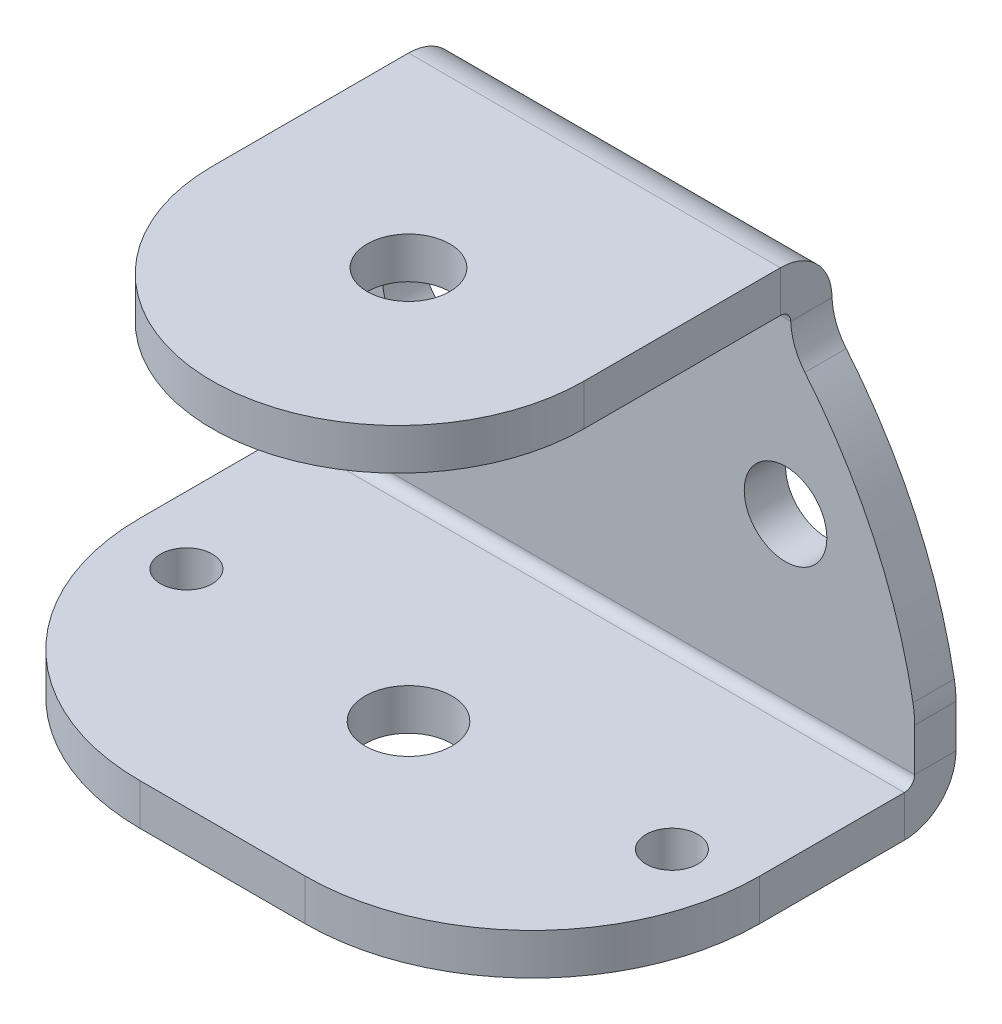
ISO-10303-21;
HEADER;
FILE_DESCRIPTION(('STEP AP214'),'2;1');
FILE_NAME('part.step','',(''),(''),'','','');
FILE_SCHEMA(('AUTOMOTIVE_DESIGN { 1 0 10303 214 1 1 1 1 }'));
ENDSEC;
DATA;
#1=APPLICATION_CONTEXT('core data for automotive mechanical design processes');
#2=APPLICATION_PROTOCOL_DEFINITION('international standard','automotive_design',2000,#1);
#3=PRODUCT_CONTEXT('',#1,'mechanical');
#4=PRODUCT('Part','Part','',(#3));
#5=PRODUCT_RELATED_PRODUCT_CATEGORY('part','',(#4));
#6=PRODUCT_DEFINITION_FORMATION('','',#4);
#7=PRODUCT_DEFINITION_CONTEXT('part definition',#1,'design');
#8=PRODUCT_DEFINITION('design','',#6,#7);
#9=PRODUCT_DEFINITION_SHAPE('','',#8);
#10=(LENGTH_UNIT() NAMED_UNIT(*) SI_UNIT(.MILLI.,.METRE.));
#11=(NAMED_UNIT(*) PLANE_ANGLE_UNIT() SI_UNIT($,.RADIAN.));
#12=(NAMED_UNIT(*) SI_UNIT($,.STERADIAN.) SOLID_ANGLE_UNIT());
#13=UNCERTAINTY_MEASURE_WITH_UNIT(LENGTH_MEASURE(1.E-05),#10,'distance_accuracy_value','');
#14=(GEOMETRIC_REPRESENTATION_CONTEXT(3) GLOBAL_UNCERTAINTY_ASSIGNED_CONTEXT((#13)) GLOBAL_UNIT_ASSIGNED_CONTEXT((#10,
#11,#12)) REPRESENTATION_CONTEXT('',''));
#15=CARTESIAN_POINT('',(0.,0.,0.));
#16=DIRECTION('',(0.,0.,1.));
#17=DIRECTION('',(1.,0.,0.));
#18=AXIS2_PLACEMENT_3D('',#15,#16,#17);
#19=CARTESIAN_POINT('',(15.,19.,9.99999999999999));
#20=DIRECTION('',(0.,1.,0.));
#21=DIRECTION('',(0.,0.,1.));
#22=AXIS2_PLACEMENT_3D('',#19,#20,#21);
#23=PLANE('',#22);
#24=DIRECTION('',(0.,0.,1.));
#25=VECTOR('',#24,1.);
#26=CARTESIAN_POINT('',(24.,19.,9.99999999999999));
#27=LINE('',#26,#25);
#28=CARTESIAN_POINT('',(24.,19.,9.99999999999999));
#29=VERTEX_POINT('',#28);
#30=CARTESIAN_POINT('',(24.,19.,0.49999999999999));
#31=VERTEX_POINT('',#30);
#32=EDGE_CURVE('E238',#29,#31,#27,.F.);
#33=ORIENTED_EDGE('',*,*,#32,.T.);
#34=DIRECTION('',(-1.,0.,0.));
#35=VECTOR('',#34,1.);
#36=CARTESIAN_POINT('',(15.,19.,0.49999999999999));
#37=LINE('',#36,#35);
#38=CARTESIAN_POINT('',(6.,19.,0.49999999999999));
#39=VERTEX_POINT('',#38);
#40=EDGE_CURVE('E213',#31,#39,#37,.T.);
#41=ORIENTED_EDGE('',*,*,#40,.T.);
#42=DIRECTION('',(0.,0.,-1.));
#43=VECTOR('',#42,1.);
#44=CARTESIAN_POINT('',(6.,19.,9.99999999999999));
#45=LINE('',#44,#43);
#46=CARTESIAN_POINT('',(6.,19.,9.99999999999999));
#47=VERTEX_POINT('',#46);
#48=EDGE_CURVE('E235',#39,#47,#45,.F.);
#49=ORIENTED_EDGE('',*,*,#48,.T.);
#50=CARTESIAN_POINT('',(15.,19.,9.99999999999999));
#51=DIRECTION('',(0.,1.,0.));
#52=DIRECTION('',(0.,0.,1.));
#53=AXIS2_PLACEMENT_3D('',#50,#51,#52);
#54=CIRCLE('',#53,9.);
#55=EDGE_CURVE('E245',#47,#29,#54,.T.);
#56=ORIENTED_EDGE('',*,*,#55,.T.);
#57=EDGE_LOOP('',(#33,#41,#49,#56));
#58=FACE_BOUND('',#57,.T.);
#59=CARTESIAN_POINT('',(15.,19.,9.50000000000006));
#60=DIRECTION('',(0.,1.,0.));
#61=DIRECTION('',(0.,0.,1.));
#62=AXIS2_PLACEMENT_3D('',#59,#60,#61);
#63=CIRCLE('',#62,2.);
#64=CARTESIAN_POINT('',(15.,19.,11.5000000000001));
#65=VERTEX_POINT('',#64);
#66=EDGE_CURVE('E875',#65,#65,#63,.T.);
#67=ORIENTED_EDGE('',*,*,#66,.F.);
#68=EDGE_LOOP('',(#67));
#69=FACE_BOUND('',#68,.T.);
#70=ADVANCED_FACE('F69',(#58,#69),#23,.T.);
#71=CARTESIAN_POINT('',(15.,17.,10.));
#72=DIRECTION('',(0.,1.,0.));
#73=DIRECTION('',(0.,0.,1.));
#74=AXIS2_PLACEMENT_3D('',#71,#72,#73);
#75=PLANE('',#74);
#76=DIRECTION('',(1.,0.,0.));
#77=VECTOR('',#76,1.);
#78=CARTESIAN_POINT('',(24.,17.,0.499999999999997));
#79=LINE('',#78,#77);
#80=CARTESIAN_POINT('',(24.,17.,0.499999999999997));
#81=VERTEX_POINT('',#80);
#82=CARTESIAN_POINT('',(6.,17.,0.499999999999997));
#83=VERTEX_POINT('',#82);
#84=EDGE_CURVE('E230',#81,#83,#79,.F.);
#85=ORIENTED_EDGE('',*,*,#84,.F.);
#86=DIRECTION('',(0.,0.,-1.));
#87=VECTOR('',#86,1.);
#88=CARTESIAN_POINT('',(24.,17.,0.));
#89=LINE('',#88,#87);
#90=CARTESIAN_POINT('',(24.,17.,10.));
#91=VERTEX_POINT('',#90);
#92=EDGE_CURVE('E239',#91,#81,#89,.T.);
#93=ORIENTED_EDGE('',*,*,#92,.F.);
#94=CARTESIAN_POINT('',(15.,17.,10.));
#95=DIRECTION('',(0.,1.,0.));
#96=DIRECTION('',(0.,0.,1.));
#97=AXIS2_PLACEMENT_3D('',#94,#95,#96);
#98=CIRCLE('',#97,9.);
#99=CARTESIAN_POINT('',(6.,17.,10.));
#100=VERTEX_POINT('',#99);
#101=EDGE_CURVE('E249',#100,#91,#98,.T.);
#102=ORIENTED_EDGE('',*,*,#101,.F.);
#103=DIRECTION('',(0.,0.,1.));
#104=VECTOR('',#103,1.);
#105=CARTESIAN_POINT('',(6.,17.,10.));
#106=LINE('',#105,#104);
#107=EDGE_CURVE('E254',#83,#100,#106,.T.);
#108=ORIENTED_EDGE('',*,*,#107,.F.);
#109=EDGE_LOOP('',(#85,#93,#102,#108));
#110=FACE_BOUND('',#109,.T.);
#111=CARTESIAN_POINT('',(15.,17.,9.50000000000007));
#112=DIRECTION('',(0.,1.,0.));
#113=DIRECTION('',(0.,0.,1.));
#114=AXIS2_PLACEMENT_3D('',#111,#112,#113);
#115=CIRCLE('',#114,2.);
#116=CARTESIAN_POINT('',(15.,17.,11.5000000000001));
#117=VERTEX_POINT('',#116);
#118=EDGE_CURVE('E878',#117,#117,#115,.T.);
#119=ORIENTED_EDGE('',*,*,#118,.T.);
#120=EDGE_LOOP('',(#119));
#121=FACE_BOUND('',#120,.T.);
#122=ADVANCED_FACE('F443',(#110,#121),#75,.F.);
#123=CARTESIAN_POINT('',(30.,0.,-2.));
#124=DIRECTION('',(1.,0.,0.));
#125=DIRECTION('',(0.,0.,-1.));
#126=AXIS2_PLACEMENT_3D('',#123,#124,#125);
#127=PLANE('',#126);
#128=DIRECTION('',(0.,1.,0.));
#129=VECTOR('',#128,1.);
#130=CARTESIAN_POINT('',(30.,0.,0.));
#131=LINE('',#130,#129);
#132=CARTESIAN_POINT('',(30.,0.499999999999998,0.));
#133=VERTEX_POINT('',#132);
#134=CARTESIAN_POINT('',(30.,2.57347687138422,0.));
#135=VERTEX_POINT('',#134);
#136=EDGE_CURVE('E329',#133,#135,#131,.T.);
#137=ORIENTED_EDGE('',*,*,#136,.F.);
#138=DIRECTION('',(0.,0.,-1.));
#139=VECTOR('',#138,1.);
#140=CARTESIAN_POINT('',(30.,0.499999999999998,0.));
#141=LINE('',#140,#139);
#142=CARTESIAN_POINT('',(30.,0.499999999999999,-2.));
#143=VERTEX_POINT('',#142);
#144=EDGE_CURVE('E297',#133,#143,#141,.T.);
#145=ORIENTED_EDGE('',*,*,#144,.T.);
#146=DIRECTION('',(0.,1.,0.));
#147=VECTOR('',#146,1.);
#148=CARTESIAN_POINT('',(30.,0.,-2.));
#149=LINE('',#148,#147);
#150=CARTESIAN_POINT('',(30.,2.57347687138422,-2.));
#151=VERTEX_POINT('',#150);
#152=EDGE_CURVE('E317',#143,#151,#149,.T.);
#153=ORIENTED_EDGE('',*,*,#152,.T.);
#154=DIRECTION('',(0.,0.,1.));
#155=VECTOR('',#154,1.);
#156=CARTESIAN_POINT('',(30.,2.57347687138422,-2.));
#157=LINE('',#156,#155);
#158=EDGE_CURVE('E340',#151,#135,#157,.T.);
#159=ORIENTED_EDGE('',*,*,#158,.T.);
#160=EDGE_LOOP('',(#137,#145,#153,#159));
#161=FACE_BOUND('',#160,.T.);
#162=ADVANCED_FACE('F448',(#161),#127,.T.);
#163=CARTESIAN_POINT('',(5.78603555394966,-0.932702934104169,-2.));
#164=DIRECTION('',(0.,0.,1.));
#165=DIRECTION('',(1.,0.,0.));
#166=AXIS2_PLACEMENT_3D('',#163,#164,#165);
#167=PLANE('',#166);
#168=CARTESIAN_POINT('',(23.75,8.29999999999993,-2.));
#169=DIRECTION('',(0.,0.,-1.));
#170=DIRECTION('',(-1.,0.,0.));
#171=AXIS2_PLACEMENT_3D('',#168,#169,#170);
#172=CIRCLE('',#171,2.);
#173=CARTESIAN_POINT('',(21.75,8.29999999999993,-2.));
#174=VERTEX_POINT('',#173);
#175=EDGE_CURVE('E849',#174,#174,#172,.T.);
#176=ORIENTED_EDGE('',*,*,#175,.F.);
#177=EDGE_LOOP('',(#176));
#178=FACE_BOUND('',#177,.T.);
#179=CARTESIAN_POINT('',(6.25,8.29999999999994,-2.));
#180=DIRECTION('',(0.,0.,-1.));
#181=DIRECTION('',(-1.,0.,0.));
#182=AXIS2_PLACEMENT_3D('',#179,#180,#181);
#183=CIRCLE('',#182,2.);
#184=CARTESIAN_POINT('',(4.25,8.29999999999994,-2.));
#185=VERTEX_POINT('',#184);
#186=EDGE_CURVE('E262',#185,#185,#183,.T.);
#187=ORIENTED_EDGE('',*,*,#186,.F.);
#188=EDGE_LOOP('',(#187));
#189=FACE_BOUND('',#188,.T.);
#190=DIRECTION('',(1.,0.,0.));
#191=VECTOR('',#190,1.);
#192=CARTESIAN_POINT('',(30.,0.499999999999999,-2.));
#193=LINE('',#192,#191);
#194=CARTESIAN_POINT('',(0.,0.500000000000012,-2.));
#195=VERTEX_POINT('',#194);
#196=EDGE_CURVE('E291',#143,#195,#193,.F.);
#197=ORIENTED_EDGE('',*,*,#196,.T.);
#198=DIRECTION('',(0.,-1.,0.));
#199=VECTOR('',#198,1.);
#200=CARTESIAN_POINT('',(0.,3.,-2.));
#201=LINE('',#200,#199);
#202=CARTESIAN_POINT('',(0.,2.57347687138424,-2.));
#203=VERTEX_POINT('',#202);
#204=EDGE_CURVE('E314',#203,#195,#201,.T.);
#205=ORIENTED_EDGE('',*,*,#204,.F.);
#206=CARTESIAN_POINT('',(5.,2.57347687138424,-2.));
#207=DIRECTION('',(0.,0.,1.));
#208=DIRECTION('',(1.,0.,0.));
#209=AXIS2_PLACEMENT_3D('',#206,#207,#208);
#210=CIRCLE('',#209,5.);
#211=CARTESIAN_POINT('',(0.0812251018111228,3.47105890158927,-2.));
#212=VERTEX_POINT('',#211);
#213=EDGE_CURVE('E351',#203,#212,#210,.F.);
#214=ORIENTED_EDGE('',*,*,#213,.T.);
#215=CARTESIAN_POINT('',(24.2139644460503,-0.932702934104169,-2.));
#216=DIRECTION('',(0.,0.,1.));
#217=DIRECTION('',(-1.,0.,0.));
#218=AXIS2_PLACEMENT_3D('',#215,#216,#217);
#219=CIRCLE('',#218,24.53125);
#220=CARTESIAN_POINT('',(5.31370161287268,14.7057845694655,-2.));
#221=VERTEX_POINT('',#220);
#222=EDGE_CURVE('E324',#221,#212,#219,.T.);
#223=ORIENTED_EDGE('',*,*,#222,.F.);
#224=CARTESIAN_POINT('',(3.00233189059873,16.6182620221313,-2.));
#225=DIRECTION('',(0.,0.,1.));
#226=DIRECTION('',(1.,0.,0.));
#227=AXIS2_PLACEMENT_3D('',#224,#225,#226);
#228=CIRCLE('',#227,3.);
#229=CARTESIAN_POINT('',(6.,16.5,-2.));
#230=VERTEX_POINT('',#229);
#231=EDGE_CURVE('E369',#221,#230,#228,.T.);
#232=ORIENTED_EDGE('',*,*,#231,.T.);
#233=DIRECTION('',(-1.,0.,0.));
#234=VECTOR('',#233,1.);
#235=CARTESIAN_POINT('',(24.,16.5,-2.));
#236=LINE('',#235,#234);
#237=CARTESIAN_POINT('',(24.,16.5,-2.));
#238=VERTEX_POINT('',#237);
#239=EDGE_CURVE('E215',#238,#230,#236,.T.);
#240=ORIENTED_EDGE('',*,*,#239,.F.);
#241=CARTESIAN_POINT('',(26.9976681094013,16.6182620221313,-2.));
#242=DIRECTION('',(0.,0.,1.));
#243=DIRECTION('',(1.,0.,0.));
#244=AXIS2_PLACEMENT_3D('',#241,#242,#243);
#245=CIRCLE('',#244,3.);
#246=CARTESIAN_POINT('',(24.6862983871273,14.7057845694655,-2.));
#247=VERTEX_POINT('',#246);
#248=EDGE_CURVE('E374',#238,#247,#245,.T.);
#249=ORIENTED_EDGE('',*,*,#248,.T.);
#250=CARTESIAN_POINT('',(5.78603555394966,-0.932702934104169,-2.));
#251=DIRECTION('',(0.,0.,1.));
#252=DIRECTION('',(1.,0.,0.));
#253=AXIS2_PLACEMENT_3D('',#250,#251,#252);
#254=CIRCLE('',#253,24.53125);
#255=CARTESIAN_POINT('',(29.9187748981889,3.47105890158924,-2.));
#256=VERTEX_POINT('',#255);
#257=EDGE_CURVE('E320',#256,#247,#254,.T.);
#258=ORIENTED_EDGE('',*,*,#257,.F.);
#259=CARTESIAN_POINT('',(25.,2.57347687138422,-2.));
#260=DIRECTION('',(0.,0.,1.));
#261=DIRECTION('',(1.,0.,0.));
#262=AXIS2_PLACEMENT_3D('',#259,#260,#261);
#263=CIRCLE('',#262,5.);
#264=EDGE_CURVE('E354',#256,#151,#263,.F.);
#265=ORIENTED_EDGE('',*,*,#264,.T.);
#266=ORIENTED_EDGE('',*,*,#152,.F.);
#267=EDGE_LOOP('',(#197,#205,#214,#223,#232,#240,#249,#258,#265,#266));
#268=FACE_BOUND('',#267,.T.);
#269=ADVANCED_FACE('F721',(#178,#189,#268),#167,.F.);
#270=CARTESIAN_POINT('',(5.78603555394966,-0.932702934104169,0.));
#271=DIRECTION('',(0.,0.,1.));
#272=DIRECTION('',(1.,0.,0.));
#273=AXIS2_PLACEMENT_3D('',#270,#271,#272);
#274=PLANE('',#273);
#275=CARTESIAN_POINT('',(23.75,8.29999999999993,0.));
#276=DIRECTION('',(0.,0.,1.));
#277=DIRECTION('',(1.,0.,0.));
#278=AXIS2_PLACEMENT_3D('',#275,#276,#277);
#279=CIRCLE('',#278,2.);
#280=CARTESIAN_POINT('',(25.75,8.29999999999993,0.));
#281=VERTEX_POINT('',#280);
#282=EDGE_CURVE('E852',#281,#281,#279,.F.);
#283=ORIENTED_EDGE('',*,*,#282,.T.);
#284=EDGE_LOOP('',(#283));
#285=FACE_BOUND('',#284,.T.);
#286=CARTESIAN_POINT('',(6.25,8.29999999999994,0.));
#287=DIRECTION('',(0.,0.,1.));
#288=DIRECTION('',(1.,0.,0.));
#289=AXIS2_PLACEMENT_3D('',#286,#287,#288);
#290=CIRCLE('',#289,2.);
#291=CARTESIAN_POINT('',(8.25,8.29999999999994,0.));
#292=VERTEX_POINT('',#291);
#293=EDGE_CURVE('E846',#292,#292,#290,.F.);
#294=ORIENTED_EDGE('',*,*,#293,.T.);
#295=EDGE_LOOP('',(#294));
#296=FACE_BOUND('',#295,.T.);
#297=DIRECTION('',(0.,-1.,0.));
#298=VECTOR('',#297,1.);
#299=CARTESIAN_POINT('',(0.,3.,0.));
#300=LINE('',#299,#298);
#301=CARTESIAN_POINT('',(0.,2.57347687138424,0.));
#302=VERTEX_POINT('',#301);
#303=CARTESIAN_POINT('',(0.,0.499999999999998,0.));
#304=VERTEX_POINT('',#303);
#305=EDGE_CURVE('E311',#302,#304,#300,.T.);
#306=ORIENTED_EDGE('',*,*,#305,.T.);
#307=DIRECTION('',(1.,0.,0.));
#308=VECTOR('',#307,1.);
#309=CARTESIAN_POINT('',(30.,0.499999999999998,0.));
#310=LINE('',#309,#308);
#311=EDGE_CURVE('E303',#133,#304,#310,.F.);
#312=ORIENTED_EDGE('',*,*,#311,.F.);
#313=ORIENTED_EDGE('',*,*,#136,.T.);
#314=CARTESIAN_POINT('',(25.,2.57347687138422,0.));
#315=DIRECTION('',(0.,0.,1.));
#316=DIRECTION('',(1.,0.,0.));
#317=AXIS2_PLACEMENT_3D('',#314,#315,#316);
#318=CIRCLE('',#317,5.);
#319=CARTESIAN_POINT('',(29.9187748981889,3.47105890158924,0.));
#320=VERTEX_POINT('',#319);
#321=EDGE_CURVE('E347',#135,#320,#318,.T.);
#322=ORIENTED_EDGE('',*,*,#321,.T.);
#323=CARTESIAN_POINT('',(5.78603555394966,-0.932702934104169,0.));
#324=DIRECTION('',(0.,0.,1.));
#325=DIRECTION('',(1.,0.,0.));
#326=AXIS2_PLACEMENT_3D('',#323,#324,#325);
#327=CIRCLE('',#326,24.53125);
#328=CARTESIAN_POINT('',(24.6862983871273,14.7057845694655,0.));
#329=VERTEX_POINT('',#328);
#330=EDGE_CURVE('E331',#320,#329,#327,.T.);
#331=ORIENTED_EDGE('',*,*,#330,.T.);
#332=CARTESIAN_POINT('',(26.9976681094013,16.6182620221313,0.));
#333=DIRECTION('',(0.,0.,1.));
#334=DIRECTION('',(1.,0.,0.));
#335=AXIS2_PLACEMENT_3D('',#332,#333,#334);
#336=CIRCLE('',#335,3.);
#337=CARTESIAN_POINT('',(24.,16.5,0.));
#338=VERTEX_POINT('',#337);
#339=EDGE_CURVE('E372',#329,#338,#336,.F.);
#340=ORIENTED_EDGE('',*,*,#339,.T.);
#341=DIRECTION('',(-1.,0.,0.));
#342=VECTOR('',#341,1.);
#343=CARTESIAN_POINT('',(24.,16.5,0.));
#344=LINE('',#343,#342);
#345=CARTESIAN_POINT('',(6.,16.5,0.));
#346=VERTEX_POINT('',#345);
#347=EDGE_CURVE('E334',#338,#346,#344,.T.);
#348=ORIENTED_EDGE('',*,*,#347,.T.);
#349=CARTESIAN_POINT('',(3.00233189059873,16.6182620221313,0.));
#350=DIRECTION('',(0.,0.,1.));
#351=DIRECTION('',(1.,0.,0.));
#352=AXIS2_PLACEMENT_3D('',#349,#350,#351);
#353=CIRCLE('',#352,3.);
#354=CARTESIAN_POINT('',(5.31370161287268,14.7057845694655,0.));
#355=VERTEX_POINT('',#354);
#356=EDGE_CURVE('E367',#346,#355,#353,.F.);
#357=ORIENTED_EDGE('',*,*,#356,.T.);
#358=CARTESIAN_POINT('',(24.2139644460503,-0.932702934104169,0.));
#359=DIRECTION('',(0.,0.,1.));
#360=DIRECTION('',(-1.,0.,0.));
#361=AXIS2_PLACEMENT_3D('',#358,#359,#360);
#362=CIRCLE('',#361,24.53125);
#363=CARTESIAN_POINT('',(0.0812251018111228,3.47105890158927,0.));
#364=VERTEX_POINT('',#363);
#365=EDGE_CURVE('E318',#355,#364,#362,.T.);
#366=ORIENTED_EDGE('',*,*,#365,.T.);
#367=CARTESIAN_POINT('',(5.,2.57347687138424,0.));
#368=DIRECTION('',(0.,0.,1.));
#369=DIRECTION('',(1.,0.,0.));
#370=AXIS2_PLACEMENT_3D('',#367,#368,#369);
#371=CIRCLE('',#370,5.);
#372=EDGE_CURVE('E345',#364,#302,#371,.T.);
#373=ORIENTED_EDGE('',*,*,#372,.T.);
#374=EDGE_LOOP('',(#306,#312,#313,#322,#331,#340,#348,#357,#366,#373));
#375=FACE_BOUND('',#374,.T.);
#376=ADVANCED_FACE('F428',(#285,#296,#375),#274,.T.);
#377=CARTESIAN_POINT('',(0.,3.,-2.));
#378=DIRECTION('',(-1.,0.,0.));
#379=DIRECTION('',(0.,-1.,0.));
#380=AXIS2_PLACEMENT_3D('',#377,#378,#379);
#381=PLANE('',#380);
#382=DIRECTION('',(0.,0.,-1.));
#383=VECTOR('',#382,1.);
#384=CARTESIAN_POINT('',(0.,0.499999999999998,0.));
#385=LINE('',#384,#383);
#386=EDGE_CURVE('E308',#304,#195,#385,.T.);
#387=ORIENTED_EDGE('',*,*,#386,.F.);
#388=ORIENTED_EDGE('',*,*,#305,.F.);
#389=DIRECTION('',(0.,0.,1.));
#390=VECTOR('',#389,1.);
#391=CARTESIAN_POINT('',(0.,2.57347687138424,-2.));
#392=LINE('',#391,#390);
#393=EDGE_CURVE('E360',#302,#203,#392,.F.);
#394=ORIENTED_EDGE('',*,*,#393,.T.);
#395=ORIENTED_EDGE('',*,*,#204,.T.);
#396=EDGE_LOOP('',(#387,#388,#394,#395));
#397=FACE_BOUND('',#396,.T.);
#398=ADVANCED_FACE('F424',(#397),#381,.T.);
#399=CARTESIAN_POINT('',(24.2139644460503,-0.932702934104169,-2.));
#400=DIRECTION('',(0.,0.,1.));
#401=DIRECTION('',(1.,0.,0.));
#402=AXIS2_PLACEMENT_3D('',#399,#400,#401);
#403=CYLINDRICAL_SURFACE('',#402,24.53125);
#404=ORIENTED_EDGE('',*,*,#365,.F.);
#405=DIRECTION('',(0.,0.,1.));
#406=VECTOR('',#405,1.);
#407=CARTESIAN_POINT('',(5.31370161287268,14.7057845694655,-2.));
#408=LINE('',#407,#406);
#409=EDGE_CURVE('E362',#355,#221,#408,.F.);
#410=ORIENTED_EDGE('',*,*,#409,.T.);
#411=ORIENTED_EDGE('',*,*,#222,.T.);
#412=DIRECTION('',(0.,0.,1.));
#413=VECTOR('',#412,1.);
#414=CARTESIAN_POINT('',(0.0812251018111193,3.47105890158927,-2.));
#415=LINE('',#414,#413);
#416=EDGE_CURVE('E357',#212,#364,#415,.T.);
#417=ORIENTED_EDGE('',*,*,#416,.T.);
#418=EDGE_LOOP('',(#404,#410,#411,#417));
#419=FACE_BOUND('',#418,.T.);
#420=ADVANCED_FACE('F783',(#419),#403,.T.);
#421=CARTESIAN_POINT('',(5.78603555394966,-0.932702934104169,-2.));
#422=DIRECTION('',(0.,0.,1.));
#423=DIRECTION('',(1.,0.,0.));
#424=AXIS2_PLACEMENT_3D('',#421,#422,#423);
#425=CYLINDRICAL_SURFACE('',#424,24.53125);
#426=ORIENTED_EDGE('',*,*,#257,.T.);
#427=DIRECTION('',(0.,0.,1.));
#428=VECTOR('',#427,1.);
#429=CARTESIAN_POINT('',(24.6862983871273,14.7057845694655,-2.));
#430=LINE('',#429,#428);
#431=EDGE_CURVE('E364',#247,#329,#430,.T.);
#432=ORIENTED_EDGE('',*,*,#431,.T.);
#433=ORIENTED_EDGE('',*,*,#330,.F.);
#434=DIRECTION('',(0.,0.,1.));
#435=VECTOR('',#434,1.);
#436=CARTESIAN_POINT('',(29.9187748981889,3.47105890158924,-2.));
#437=LINE('',#436,#435);
#438=EDGE_CURVE('E349',#320,#256,#437,.F.);
#439=ORIENTED_EDGE('',*,*,#438,.T.);
#440=EDGE_LOOP('',(#426,#432,#433,#439));
#441=FACE_BOUND('',#440,.T.);
#442=ADVANCED_FACE('F774',(#441),#425,.T.);
#443=CARTESIAN_POINT('',(25.,2.57347687138422,-2.));
#444=DIRECTION('',(0.,0.,1.));
#445=DIRECTION('',(1.,0.,0.));
#446=AXIS2_PLACEMENT_3D('',#443,#444,#445);
#447=CYLINDRICAL_SURFACE('',#446,5.);
#448=ORIENTED_EDGE('',*,*,#264,.F.);
#449=ORIENTED_EDGE('',*,*,#438,.F.);
#450=ORIENTED_EDGE('',*,*,#321,.F.);
#451=ORIENTED_EDGE('',*,*,#158,.F.);
#452=EDGE_LOOP('',(#448,#449,#450,#451));
#453=FACE_BOUND('',#452,.T.);
#454=ADVANCED_FACE('F764',(#453),#447,.T.);
#455=CARTESIAN_POINT('',(5.,2.57347687138424,-2.));
#456=DIRECTION('',(0.,0.,1.));
#457=DIRECTION('',(1.,0.,0.));
#458=AXIS2_PLACEMENT_3D('',#455,#456,#457);
#459=CYLINDRICAL_SURFACE('',#458,5.);
#460=ORIENTED_EDGE('',*,*,#213,.F.);
#461=ORIENTED_EDGE('',*,*,#393,.F.);
#462=ORIENTED_EDGE('',*,*,#372,.F.);
#463=ORIENTED_EDGE('',*,*,#416,.F.);
#464=EDGE_LOOP('',(#460,#461,#462,#463));
#465=FACE_BOUND('',#464,.T.);
#466=ADVANCED_FACE('F755',(#465),#459,.T.);
#467=CARTESIAN_POINT('',(3.00233189059873,16.6182620221313,-2.));
#468=DIRECTION('',(0.,0.,-1.));
#469=DIRECTION('',(-1.,0.,0.));
#470=AXIS2_PLACEMENT_3D('',#467,#468,#469);
#471=CYLINDRICAL_SURFACE('',#470,3.);
#472=ORIENTED_EDGE('',*,*,#231,.F.);
#473=ORIENTED_EDGE('',*,*,#409,.F.);
#474=ORIENTED_EDGE('',*,*,#356,.F.);
#475=DIRECTION('',(0.,0.,1.));
#476=VECTOR('',#475,1.);
#477=CARTESIAN_POINT('',(6.,16.5,-2.));
#478=LINE('',#477,#476);
#479=EDGE_CURVE('E338',#230,#346,#478,.T.);
#480=ORIENTED_EDGE('',*,*,#479,.F.);
#481=EDGE_LOOP('',(#472,#473,#474,#480));
#482=FACE_BOUND('',#481,.T.);
#483=ADVANCED_FACE('F747',(#482),#471,.F.);
#484=CARTESIAN_POINT('',(26.9976681094013,16.6182620221313,-2.));
#485=DIRECTION('',(0.,0.,-1.));
#486=DIRECTION('',(-1.,0.,0.));
#487=AXIS2_PLACEMENT_3D('',#484,#485,#486);
#488=CYLINDRICAL_SURFACE('',#487,3.);
#489=ORIENTED_EDGE('',*,*,#248,.F.);
#490=DIRECTION('',(0.,0.,1.));
#491=VECTOR('',#490,1.);
#492=CARTESIAN_POINT('',(24.,16.5,-2.));
#493=LINE('',#492,#491);
#494=EDGE_CURVE('E326',#238,#338,#493,.T.);
#495=ORIENTED_EDGE('',*,*,#494,.T.);
#496=ORIENTED_EDGE('',*,*,#339,.F.);
#497=ORIENTED_EDGE('',*,*,#431,.F.);
#498=EDGE_LOOP('',(#489,#495,#496,#497));
#499=FACE_BOUND('',#498,.T.);
#500=ADVANCED_FACE('F713',(#499),#488,.F.);
#501=CARTESIAN_POINT('',(0.,0.499999999999998,0.5));
#502=DIRECTION('',(-1.,0.,0.));
#503=DIRECTION('',(0.,0.,1.));
#504=AXIS2_PLACEMENT_3D('',#501,#502,#503);
#505=PLANE('',#504);
#506=DIRECTION('',(0.,-1.,0.));
#507=VECTOR('',#506,1.);
#508=CARTESIAN_POINT('',(0.,0.,0.499999999999998));
#509=LINE('',#508,#507);
#510=CARTESIAN_POINT('',(0.,0.,0.499999999999998));
#511=VERTEX_POINT('',#510);
#512=CARTESIAN_POINT('',(0.,-2.,0.499999999999991));
#513=VERTEX_POINT('',#512);
#514=EDGE_CURVE('E263',#511,#513,#509,.T.);
#515=ORIENTED_EDGE('',*,*,#514,.F.);
#516=CARTESIAN_POINT('',(0.,0.499999999999998,0.5));
#517=DIRECTION('',(1.,0.,0.));
#518=DIRECTION('',(0.,0.,-1.));
#519=AXIS2_PLACEMENT_3D('',#516,#517,#518);
#520=CIRCLE('',#519,0.5);
#521=EDGE_CURVE('E300',#304,#511,#520,.F.);
#522=ORIENTED_EDGE('',*,*,#521,.F.);
#523=ORIENTED_EDGE('',*,*,#386,.T.);
#524=CARTESIAN_POINT('',(0.,0.499999999999998,0.5));
#525=DIRECTION('',(1.,0.,0.));
#526=DIRECTION('',(0.,0.,-1.));
#527=AXIS2_PLACEMENT_3D('',#524,#525,#526);
#528=CIRCLE('',#527,2.5);
#529=EDGE_CURVE('E293',#195,#513,#528,.F.);
#530=ORIENTED_EDGE('',*,*,#529,.T.);
#531=EDGE_LOOP('',(#515,#522,#523,#530));
#532=FACE_BOUND('',#531,.T.);
#533=ADVANCED_FACE('F420',(#532),#505,.T.);
#534=CARTESIAN_POINT('',(30.,0.499999999999998,0.5));
#535=DIRECTION('',(-1.,0.,0.));
#536=DIRECTION('',(0.,0.,1.));
#537=AXIS2_PLACEMENT_3D('',#534,#535,#536);
#538=PLANE('',#537);
#539=CARTESIAN_POINT('',(30.,0.499999999999998,0.5));
#540=DIRECTION('',(1.,0.,0.));
#541=DIRECTION('',(0.,0.,-1.));
#542=AXIS2_PLACEMENT_3D('',#539,#540,#541);
#543=CIRCLE('',#542,0.5);
#544=CARTESIAN_POINT('',(30.,0.,0.499999999999998));
#545=VERTEX_POINT('',#544);
#546=EDGE_CURVE('E286',#545,#133,#543,.T.);
#547=ORIENTED_EDGE('',*,*,#546,.F.);
#548=DIRECTION('',(0.,-1.,0.));
#549=VECTOR('',#548,1.);
#550=CARTESIAN_POINT('',(30.,0.,0.499999999999998));
#551=LINE('',#550,#549);
#552=CARTESIAN_POINT('',(30.,-2.,0.499999999999991));
#553=VERTEX_POINT('',#552);
#554=EDGE_CURVE('E270',#545,#553,#551,.T.);
#555=ORIENTED_EDGE('',*,*,#554,.T.);
#556=CARTESIAN_POINT('',(30.,0.499999999999998,0.5));
#557=DIRECTION('',(1.,0.,0.));
#558=DIRECTION('',(0.,0.,-1.));
#559=AXIS2_PLACEMENT_3D('',#556,#557,#558);
#560=CIRCLE('',#559,2.5);
#561=EDGE_CURVE('E294',#553,#143,#560,.T.);
#562=ORIENTED_EDGE('',*,*,#561,.T.);
#563=ORIENTED_EDGE('',*,*,#144,.F.);
#564=EDGE_LOOP('',(#547,#555,#562,#563));
#565=FACE_BOUND('',#564,.T.);
#566=ADVANCED_FACE('F413',(#565),#538,.F.);
#567=CARTESIAN_POINT('',(30.,0.499999999999998,0.5));
#568=DIRECTION('',(1.,0.,0.));
#569=DIRECTION('',(0.,-1.,0.));
#570=AXIS2_PLACEMENT_3D('',#567,#568,#569);
#571=CYLINDRICAL_SURFACE('',#570,2.5);
#572=ORIENTED_EDGE('',*,*,#196,.F.);
#573=ORIENTED_EDGE('',*,*,#561,.F.);
#574=DIRECTION('',(-1.,0.,0.));
#575=VECTOR('',#574,1.);
#576=CARTESIAN_POINT('',(0.,-2.,0.499999999999991));
#577=LINE('',#576,#575);
#578=EDGE_CURVE('E273',#553,#513,#577,.T.);
#579=ORIENTED_EDGE('',*,*,#578,.T.);
#580=ORIENTED_EDGE('',*,*,#529,.F.);
#581=EDGE_LOOP('',(#572,#573,#579,#580));
#582=FACE_BOUND('',#581,.T.);
#583=ADVANCED_FACE('F418',(#582),#571,.T.);
#584=CARTESIAN_POINT('',(30.,0.499999999999998,0.5));
#585=DIRECTION('',(1.,0.,0.));
#586=DIRECTION('',(0.,-1.,0.));
#587=AXIS2_PLACEMENT_3D('',#584,#585,#586);
#588=CYLINDRICAL_SURFACE('',#587,0.5);
#589=ORIENTED_EDGE('',*,*,#311,.T.);
#590=ORIENTED_EDGE('',*,*,#521,.T.);
#591=DIRECTION('',(1.,0.,0.));
#592=VECTOR('',#591,1.);
#593=CARTESIAN_POINT('',(0.,0.,0.499999999999998));
#594=LINE('',#593,#592);
#595=EDGE_CURVE('E268',#511,#545,#594,.T.);
#596=ORIENTED_EDGE('',*,*,#595,.T.);
#597=ORIENTED_EDGE('',*,*,#546,.T.);
#598=EDGE_LOOP('',(#589,#590,#596,#597));
#599=FACE_BOUND('',#598,.T.);
#600=ADVANCED_FACE('F432',(#599),#588,.F.);
#601=CARTESIAN_POINT('',(0.,-2.,0.));
#602=DIRECTION('',(1.,0.,0.));
#603=DIRECTION('',(0.,0.,-1.));
#604=AXIS2_PLACEMENT_3D('',#601,#602,#603);
#605=PLANE('',#604);
#606=DIRECTION('',(0.,0.,-1.));
#607=VECTOR('',#606,1.);
#608=CARTESIAN_POINT('',(0.,-2.,0.));
#609=LINE('',#608,#607);
#610=CARTESIAN_POINT('',(0.,-2.00000000000003,7.49999999999999));
#611=VERTEX_POINT('',#610);
#612=EDGE_CURVE('E279',#611,#513,#609,.T.);
#613=ORIENTED_EDGE('',*,*,#612,.F.);
#614=DIRECTION('',(0.,1.,0.));
#615=VECTOR('',#614,1.);
#616=CARTESIAN_POINT('',(0.,-2.00000000000003,7.49999999999999));
#617=LINE('',#616,#615);
#618=CARTESIAN_POINT('',(0.,0.,7.5));
#619=VERTEX_POINT('',#618);
#620=EDGE_CURVE('E376',#611,#619,#617,.T.);
#621=ORIENTED_EDGE('',*,*,#620,.T.);
#622=DIRECTION('',(0.,0.,-1.));
#623=VECTOR('',#622,1.);
#624=CARTESIAN_POINT('',(0.,0.,0.));
#625=LINE('',#624,#623);
#626=EDGE_CURVE('E278',#619,#511,#625,.T.);
#627=ORIENTED_EDGE('',*,*,#626,.T.);
#628=ORIENTED_EDGE('',*,*,#514,.T.);
#629=EDGE_LOOP('',(#613,#621,#627,#628));
#630=FACE_BOUND('',#629,.T.);
#631=ADVANCED_FACE('F396',(#630),#605,.F.);
#632=CARTESIAN_POINT('',(30.,-2.00000000000006,18.5));
#633=DIRECTION('',(-1.,0.,0.));
#634=DIRECTION('',(0.,0.,1.));
#635=AXIS2_PLACEMENT_3D('',#632,#633,#634);
#636=PLANE('',#635);
#637=DIRECTION('',(0.,0.,1.));
#638=VECTOR('',#637,1.);
#639=CARTESIAN_POINT('',(30.,0.,18.5));
#640=LINE('',#639,#638);
#641=CARTESIAN_POINT('',(30.,0.,7.5));
#642=VERTEX_POINT('',#641);
#643=EDGE_CURVE('E288',#545,#642,#640,.T.);
#644=ORIENTED_EDGE('',*,*,#643,.T.);
#645=DIRECTION('',(0.,1.,0.));
#646=VECTOR('',#645,1.);
#647=CARTESIAN_POINT('',(30.,-2.00000000000003,7.49999999999999));
#648=LINE('',#647,#646);
#649=CARTESIAN_POINT('',(30.,-2.00000000000003,7.49999999999999));
#650=VERTEX_POINT('',#649);
#651=EDGE_CURVE('E15',#642,#650,#648,.F.);
#652=ORIENTED_EDGE('',*,*,#651,.T.);
#653=DIRECTION('',(0.,0.,1.));
#654=VECTOR('',#653,1.);
#655=CARTESIAN_POINT('',(30.,-2.00000000000006,18.5));
#656=LINE('',#655,#654);
#657=EDGE_CURVE('E281',#553,#650,#656,.T.);
#658=ORIENTED_EDGE('',*,*,#657,.F.);
#659=ORIENTED_EDGE('',*,*,#554,.F.);
#660=EDGE_LOOP('',(#644,#652,#658,#659));
#661=FACE_BOUND('',#660,.T.);
#662=ADVANCED_FACE('F410',(#661),#636,.F.);
#663=CARTESIAN_POINT('',(0.,-2.,0.));
#664=DIRECTION('',(0.,1.,0.));
#665=DIRECTION('',(0.,0.,1.));
#666=AXIS2_PLACEMENT_3D('',#663,#664,#665);
#667=PLANE('',#666);
#668=CARTESIAN_POINT('',(15.,-2.00000000000003,9.49999999999999));
#669=DIRECTION('',(0.,1.,0.));
#670=DIRECTION('',(0.,0.,1.));
#671=AXIS2_PLACEMENT_3D('',#668,#669,#670);
#672=CIRCLE('',#671,2.1);
#673=CARTESIAN_POINT('',(15.,-2.00000000000004,11.6));
#674=VERTEX_POINT('',#673);
#675=EDGE_CURVE('E869',#674,#674,#672,.T.);
#676=ORIENTED_EDGE('',*,*,#675,.T.);
#677=EDGE_LOOP('',(#676));
#678=FACE_BOUND('',#677,.T.);
#679=CARTESIAN_POINT('',(3.25,-2.00000000000003,8.49999999999999));
#680=DIRECTION('',(0.,1.,0.));
#681=DIRECTION('',(0.,0.,1.));
#682=AXIS2_PLACEMENT_3D('',#679,#680,#681);
#683=CIRCLE('',#682,1.24999999999999);
#684=CARTESIAN_POINT('',(3.25,-2.00000000000003,9.74999999999998));
#685=VERTEX_POINT('',#684);
#686=EDGE_CURVE('E863',#685,#685,#683,.T.);
#687=ORIENTED_EDGE('',*,*,#686,.T.);
#688=EDGE_LOOP('',(#687));
#689=FACE_BOUND('',#688,.T.);
#690=CARTESIAN_POINT('',(26.75,-2.00000000000003,8.49999999999999));
#691=DIRECTION('',(0.,1.,0.));
#692=DIRECTION('',(0.,0.,1.));
#693=AXIS2_PLACEMENT_3D('',#690,#691,#692);
#694=CIRCLE('',#693,1.24999999999999);
#695=CARTESIAN_POINT('',(26.75,-2.00000000000003,9.74999999999997));
#696=VERTEX_POINT('',#695);
#697=EDGE_CURVE('E855',#696,#696,#694,.T.);
#698=ORIENTED_EDGE('',*,*,#697,.T.);
#699=EDGE_LOOP('',(#698));
#700=FACE_BOUND('',#699,.T.);
#701=DIRECTION('',(-1.,0.,0.));
#702=VECTOR('',#701,1.);
#703=CARTESIAN_POINT('',(0.,-2.00000000000006,18.5));
#704=LINE('',#703,#702);
#705=CARTESIAN_POINT('',(19.,-2.00000000000006,18.5));
#706=VERTEX_POINT('',#705);
#707=CARTESIAN_POINT('',(11.,-2.00000000000006,18.5));
#708=VERTEX_POINT('',#707);
#709=EDGE_CURVE('E284',#706,#708,#704,.T.);
#710=ORIENTED_EDGE('',*,*,#709,.T.);
#711=CARTESIAN_POINT('',(11.,-2.00000000000003,7.49999999999999));
#712=DIRECTION('',(0.,1.,0.));
#713=DIRECTION('',(0.,0.,1.));
#714=AXIS2_PLACEMENT_3D('',#711,#712,#713);
#715=CIRCLE('',#714,11.);
#716=EDGE_CURVE('E77',#708,#611,#715,.F.);
#717=ORIENTED_EDGE('',*,*,#716,.T.);
#718=ORIENTED_EDGE('',*,*,#612,.T.);
#719=ORIENTED_EDGE('',*,*,#578,.F.);
#720=ORIENTED_EDGE('',*,*,#657,.T.);
#721=CARTESIAN_POINT('',(19.,-2.00000000000003,7.49999999999999));
#722=DIRECTION('',(0.,1.,0.));
#723=DIRECTION('',(0.,0.,1.));
#724=AXIS2_PLACEMENT_3D('',#721,#722,#723);
#725=CIRCLE('',#724,11.);
#726=EDGE_CURVE('E387',#650,#706,#725,.F.);
#727=ORIENTED_EDGE('',*,*,#726,.T.);
#728=EDGE_LOOP('',(#710,#717,#718,#719,#720,#727));
#729=FACE_BOUND('',#728,.T.);
#730=ADVANCED_FACE('F391',(#678,#689,#700,#729),#667,.F.);
#731=CARTESIAN_POINT('',(0.,0.,0.));
#732=DIRECTION('',(0.,1.,0.));
#733=DIRECTION('',(0.,0.,1.));
#734=AXIS2_PLACEMENT_3D('',#731,#732,#733);
#735=PLANE('',#734);
#736=CARTESIAN_POINT('',(15.,0.,9.5));
#737=DIRECTION('',(0.,1.,0.));
#738=DIRECTION('',(0.,0.,1.));
#739=AXIS2_PLACEMENT_3D('',#736,#737,#738);
#740=CIRCLE('',#739,2.1);
#741=CARTESIAN_POINT('',(15.,0.,11.6));
#742=VERTEX_POINT('',#741);
#743=EDGE_CURVE('E872',#742,#742,#740,.T.);
#744=ORIENTED_EDGE('',*,*,#743,.F.);
#745=EDGE_LOOP('',(#744));
#746=FACE_BOUND('',#745,.T.);
#747=CARTESIAN_POINT('',(3.25,0.,8.5));
#748=DIRECTION('',(0.,1.,0.));
#749=DIRECTION('',(0.,0.,1.));
#750=AXIS2_PLACEMENT_3D('',#747,#748,#749);
#751=CIRCLE('',#750,1.24999999999999);
#752=CARTESIAN_POINT('',(3.25,0.,9.74999999999999));
#753=VERTEX_POINT('',#752);
#754=EDGE_CURVE('E866',#753,#753,#751,.T.);
#755=ORIENTED_EDGE('',*,*,#754,.F.);
#756=EDGE_LOOP('',(#755));
#757=FACE_BOUND('',#756,.T.);
#758=CARTESIAN_POINT('',(26.75,0.,8.49999999999999));
#759=DIRECTION('',(0.,1.,0.));
#760=DIRECTION('',(0.,0.,1.));
#761=AXIS2_PLACEMENT_3D('',#758,#759,#760);
#762=CIRCLE('',#761,1.24999999999999);
#763=CARTESIAN_POINT('',(26.75,0.,9.74999999999998));
#764=VERTEX_POINT('',#763);
#765=EDGE_CURVE('E860',#764,#764,#762,.T.);
#766=ORIENTED_EDGE('',*,*,#765,.F.);
#767=EDGE_LOOP('',(#766));
#768=FACE_BOUND('',#767,.T.);
#769=ORIENTED_EDGE('',*,*,#626,.F.);
#770=CARTESIAN_POINT('',(11.,0.,7.5));
#771=DIRECTION('',(0.,1.,0.));
#772=DIRECTION('',(0.,0.,1.));
#773=AXIS2_PLACEMENT_3D('',#770,#771,#772);
#774=CIRCLE('',#773,11.);
#775=CARTESIAN_POINT('',(11.,0.,18.5));
#776=VERTEX_POINT('',#775);
#777=EDGE_CURVE('E381',#619,#776,#774,.T.);
#778=ORIENTED_EDGE('',*,*,#777,.T.);
#779=DIRECTION('',(-1.,0.,0.));
#780=VECTOR('',#779,1.);
#781=CARTESIAN_POINT('',(0.,0.,18.5));
#782=LINE('',#781,#780);
#783=CARTESIAN_POINT('',(19.,0.,18.5));
#784=VERTEX_POINT('',#783);
#785=EDGE_CURVE('E282',#784,#776,#782,.T.);
#786=ORIENTED_EDGE('',*,*,#785,.F.);
#787=CARTESIAN_POINT('',(19.,0.,7.5));
#788=DIRECTION('',(0.,1.,0.));
#789=DIRECTION('',(0.,0.,1.));
#790=AXIS2_PLACEMENT_3D('',#787,#788,#789);
#791=CIRCLE('',#790,11.);
#792=EDGE_CURVE('E379',#784,#642,#791,.T.);
#793=ORIENTED_EDGE('',*,*,#792,.T.);
#794=ORIENTED_EDGE('',*,*,#643,.F.);
#795=ORIENTED_EDGE('',*,*,#595,.F.);
#796=EDGE_LOOP('',(#769,#778,#786,#793,#794,#795));
#797=FACE_BOUND('',#796,.T.);
#798=ADVANCED_FACE('F402',(#746,#757,#768,#797),#735,.T.);
#799=CARTESIAN_POINT('',(0.,-2.00000000000006,18.5));
#800=DIRECTION('',(0.,0.,-1.));
#801=DIRECTION('',(0.,1.,0.));
#802=AXIS2_PLACEMENT_3D('',#799,#800,#801);
#803=PLANE('',#802);
#804=ORIENTED_EDGE('',*,*,#785,.T.);
#805=DIRECTION('',(0.,1.,0.));
#806=VECTOR('',#805,1.);
#807=CARTESIAN_POINT('',(11.,-2.00000000000006,18.5));
#808=LINE('',#807,#806);
#809=EDGE_CURVE('E90',#776,#708,#808,.F.);
#810=ORIENTED_EDGE('',*,*,#809,.T.);
#811=ORIENTED_EDGE('',*,*,#709,.F.);
#812=DIRECTION('',(0.,1.,0.));
#813=VECTOR('',#812,1.);
#814=CARTESIAN_POINT('',(19.,-2.00000000000006,18.5));
#815=LINE('',#814,#813);
#816=EDGE_CURVE('E383',#706,#784,#815,.T.);
#817=ORIENTED_EDGE('',*,*,#816,.T.);
#818=EDGE_LOOP('',(#804,#810,#811,#817));
#819=FACE_BOUND('',#818,.T.);
#820=ADVANCED_FACE('F404',(#819),#803,.F.);
#821=CARTESIAN_POINT('',(24.,16.5,0.499999999999999));
#822=DIRECTION('',(1.,0.,0.));
#823=DIRECTION('',(0.,0.,-1.));
#824=AXIS2_PLACEMENT_3D('',#821,#822,#823);
#825=PLANE('',#824);
#826=DIRECTION('',(0.,-1.,0.));
#827=VECTOR('',#826,1.);
#828=CARTESIAN_POINT('',(24.,19.,0.49999999999999));
#829=LINE('',#828,#827);
#830=EDGE_CURVE('E259',#81,#31,#829,.F.);
#831=ORIENTED_EDGE('',*,*,#830,.F.);
#832=CARTESIAN_POINT('',(24.,16.5,0.499999999999999));
#833=DIRECTION('',(-1.,0.,0.));
#834=DIRECTION('',(0.,0.,1.));
#835=AXIS2_PLACEMENT_3D('',#832,#833,#834);
#836=CIRCLE('',#835,0.5);
#837=EDGE_CURVE('E219',#338,#81,#836,.F.);
#838=ORIENTED_EDGE('',*,*,#837,.F.);
#839=ORIENTED_EDGE('',*,*,#494,.F.);
#840=CARTESIAN_POINT('',(24.,16.5,0.499999999999999));
#841=DIRECTION('',(-1.,0.,0.));
#842=DIRECTION('',(0.,0.,1.));
#843=AXIS2_PLACEMENT_3D('',#840,#841,#842);
#844=CIRCLE('',#843,2.5);
#845=EDGE_CURVE('E218',#238,#31,#844,.F.);
#846=ORIENTED_EDGE('',*,*,#845,.T.);
#847=EDGE_LOOP('',(#831,#838,#839,#846));
#848=FACE_BOUND('',#847,.T.);
#849=ADVANCED_FACE('F471',(#848),#825,.T.);
#850=CARTESIAN_POINT('',(6.,16.5,0.499999999999999));
#851=DIRECTION('',(1.,0.,0.));
#852=DIRECTION('',(0.,0.,-1.));
#853=AXIS2_PLACEMENT_3D('',#850,#851,#852);
#854=PLANE('',#853);
#855=CARTESIAN_POINT('',(6.,16.5,0.499999999999999));
#856=DIRECTION('',(-1.,0.,0.));
#857=DIRECTION('',(0.,0.,1.));
#858=AXIS2_PLACEMENT_3D('',#855,#856,#857);
#859=CIRCLE('',#858,0.5);
#860=EDGE_CURVE('E226',#83,#346,#859,.T.);
#861=ORIENTED_EDGE('',*,*,#860,.F.);
#862=DIRECTION('',(0.,-1.,0.));
#863=VECTOR('',#862,1.);
#864=CARTESIAN_POINT('',(6.,17.,0.499999999999997));
#865=LINE('',#864,#863);
#866=EDGE_CURVE('E223',#83,#39,#865,.F.);
#867=ORIENTED_EDGE('',*,*,#866,.T.);
#868=CARTESIAN_POINT('',(6.,16.5,0.499999999999999));
#869=DIRECTION('',(-1.,0.,0.));
#870=DIRECTION('',(0.,0.,1.));
#871=AXIS2_PLACEMENT_3D('',#868,#869,#870);
#872=CIRCLE('',#871,2.5);
#873=EDGE_CURVE('E208',#39,#230,#872,.T.);
#874=ORIENTED_EDGE('',*,*,#873,.T.);
#875=ORIENTED_EDGE('',*,*,#479,.T.);
#876=EDGE_LOOP('',(#861,#867,#874,#875));
#877=FACE_BOUND('',#876,.T.);
#878=ADVANCED_FACE('F224',(#877),#854,.F.);
#879=CARTESIAN_POINT('',(6.,16.5,0.499999999999999));
#880=DIRECTION('',(-1.,0.,0.));
#881=DIRECTION('',(0.,1.,0.));
#882=AXIS2_PLACEMENT_3D('',#879,#880,#881);
#883=CYLINDRICAL_SURFACE('',#882,2.5);
#884=ORIENTED_EDGE('',*,*,#239,.T.);
#885=ORIENTED_EDGE('',*,*,#873,.F.);
#886=ORIENTED_EDGE('',*,*,#40,.F.);
#887=ORIENTED_EDGE('',*,*,#845,.F.);
#888=EDGE_LOOP('',(#884,#885,#886,#887));
#889=FACE_BOUND('',#888,.T.);
#890=ADVANCED_FACE('F210',(#889),#883,.T.);
#891=CARTESIAN_POINT('',(6.,16.5,0.499999999999999));
#892=DIRECTION('',(-1.,0.,0.));
#893=DIRECTION('',(0.,1.,0.));
#894=AXIS2_PLACEMENT_3D('',#891,#892,#893);
#895=CYLINDRICAL_SURFACE('',#894,0.5);
#896=ORIENTED_EDGE('',*,*,#347,.F.);
#897=ORIENTED_EDGE('',*,*,#837,.T.);
#898=ORIENTED_EDGE('',*,*,#84,.T.);
#899=ORIENTED_EDGE('',*,*,#860,.T.);
#900=EDGE_LOOP('',(#896,#897,#898,#899));
#901=FACE_BOUND('',#900,.T.);
#902=ADVANCED_FACE('F464',(#901),#895,.F.);
#903=CARTESIAN_POINT('',(24.,19.,0.));
#904=DIRECTION('',(-1.,0.,0.));
#905=DIRECTION('',(0.,0.,1.));
#906=AXIS2_PLACEMENT_3D('',#903,#904,#905);
#907=PLANE('',#906);
#908=ORIENTED_EDGE('',*,*,#830,.T.);
#909=ORIENTED_EDGE('',*,*,#32,.F.);
#910=DIRECTION('',(0.,-1.,0.));
#911=VECTOR('',#910,1.);
#912=CARTESIAN_POINT('',(24.,19.,9.99999999999999));
#913=LINE('',#912,#911);
#914=EDGE_CURVE('E247',#29,#91,#913,.T.);
#915=ORIENTED_EDGE('',*,*,#914,.T.);
#916=ORIENTED_EDGE('',*,*,#92,.T.);
#917=EDGE_LOOP('',(#908,#909,#915,#916));
#918=FACE_BOUND('',#917,.T.);
#919=ADVANCED_FACE('F461',(#918),#907,.F.);
#920=CARTESIAN_POINT('',(6.,19.,10.));
#921=DIRECTION('',(1.,0.,0.));
#922=DIRECTION('',(0.,0.,-1.));
#923=AXIS2_PLACEMENT_3D('',#920,#921,#922);
#924=PLANE('',#923);
#925=ORIENTED_EDGE('',*,*,#866,.F.);
#926=ORIENTED_EDGE('',*,*,#107,.T.);
#927=DIRECTION('',(0.,-1.,0.));
#928=VECTOR('',#927,1.);
#929=CARTESIAN_POINT('',(6.,19.,10.));
#930=LINE('',#929,#928);
#931=EDGE_CURVE('E243',#47,#100,#930,.T.);
#932=ORIENTED_EDGE('',*,*,#931,.F.);
#933=ORIENTED_EDGE('',*,*,#48,.F.);
#934=EDGE_LOOP('',(#925,#926,#932,#933));
#935=FACE_BOUND('',#934,.T.);
#936=ADVANCED_FACE('F241',(#935),#924,.F.);
#937=CARTESIAN_POINT('',(15.,19.,9.99999999999999));
#938=DIRECTION('',(0.,-1.,0.));
#939=DIRECTION('',(0.,0.,-1.));
#940=AXIS2_PLACEMENT_3D('',#937,#938,#939);
#941=CYLINDRICAL_SURFACE('',#940,9.);
#942=ORIENTED_EDGE('',*,*,#101,.T.);
#943=ORIENTED_EDGE('',*,*,#914,.F.);
#944=ORIENTED_EDGE('',*,*,#55,.F.);
#945=ORIENTED_EDGE('',*,*,#931,.T.);
#946=EDGE_LOOP('',(#942,#943,#944,#945));
#947=FACE_BOUND('',#946,.T.);
#948=ADVANCED_FACE('F455',(#947),#941,.T.);
#949=CARTESIAN_POINT('',(6.25,8.29999999999994,19.001));
#950=DIRECTION('',(0.,0.,-1.));
#951=DIRECTION('',(-1.,0.,0.));
#952=AXIS2_PLACEMENT_3D('',#949,#950,#951);
#953=CYLINDRICAL_SURFACE('',#952,2.);
#954=ORIENTED_EDGE('',*,*,#293,.F.);
#955=EDGE_LOOP('',(#954));
#956=FACE_BOUND('',#955,.T.);
#957=ORIENTED_EDGE('',*,*,#186,.T.);
#958=EDGE_LOOP('',(#957));
#959=FACE_BOUND('',#958,.T.);
#960=ADVANCED_FACE('F452',(#956,#959),#953,.F.);
#961=CARTESIAN_POINT('',(23.75,8.29999999999993,19.001));
#962=DIRECTION('',(0.,0.,-1.));
#963=DIRECTION('',(-1.,0.,0.));
#964=AXIS2_PLACEMENT_3D('',#961,#962,#963);
#965=CYLINDRICAL_SURFACE('',#964,2.);
#966=ORIENTED_EDGE('',*,*,#282,.F.);
#967=EDGE_LOOP('',(#966));
#968=FACE_BOUND('',#967,.T.);
#969=ORIENTED_EDGE('',*,*,#175,.T.);
#970=EDGE_LOOP('',(#969));
#971=FACE_BOUND('',#970,.T.);
#972=ADVANCED_FACE('F541',(#968,#971),#965,.F.);
#973=CARTESIAN_POINT('',(11.,-2.00000000000003,7.49999999999999));
#974=DIRECTION('',(0.,1.,0.));
#975=DIRECTION('',(0.,0.,1.));
#976=AXIS2_PLACEMENT_3D('',#973,#974,#975);
#977=CYLINDRICAL_SURFACE('',#976,11.);
#978=ORIENTED_EDGE('',*,*,#716,.F.);
#979=ORIENTED_EDGE('',*,*,#809,.F.);
#980=ORIENTED_EDGE('',*,*,#777,.F.);
#981=ORIENTED_EDGE('',*,*,#620,.F.);
#982=EDGE_LOOP('',(#978,#979,#980,#981));
#983=FACE_BOUND('',#982,.T.);
#984=ADVANCED_FACE('F399',(#983),#977,.T.);
#985=CARTESIAN_POINT('',(19.,-2.00000000000003,7.49999999999999));
#986=DIRECTION('',(0.,1.,0.));
#987=DIRECTION('',(0.,0.,1.));
#988=AXIS2_PLACEMENT_3D('',#985,#986,#987);
#989=CYLINDRICAL_SURFACE('',#988,11.);
#990=ORIENTED_EDGE('',*,*,#726,.F.);
#991=ORIENTED_EDGE('',*,*,#651,.F.);
#992=ORIENTED_EDGE('',*,*,#792,.F.);
#993=ORIENTED_EDGE('',*,*,#816,.F.);
#994=EDGE_LOOP('',(#990,#991,#992,#993));
#995=FACE_BOUND('',#994,.T.);
#996=ADVANCED_FACE('F71',(#995),#989,.T.);
#997=CARTESIAN_POINT('',(26.75,0.,8.49999999999999));
#998=DIRECTION('',(0.,1.,0.));
#999=DIRECTION('',(0.,0.,1.));
#1000=AXIS2_PLACEMENT_3D('',#997,#998,#999);
#1001=CYLINDRICAL_SURFACE('',#1000,1.24999999999999);
#1002=ORIENTED_EDGE('',*,*,#765,.T.);
#1003=EDGE_LOOP('',(#1002));
#1004=FACE_BOUND('',#1003,.T.);
#1005=ORIENTED_EDGE('',*,*,#697,.F.);
#1006=EDGE_LOOP('',(#1005));
#1007=FACE_BOUND('',#1006,.T.);
#1008=ADVANCED_FACE('F559',(#1004,#1007),#1001,.F.);
#1009=CARTESIAN_POINT('',(3.25,0.,8.5));
#1010=DIRECTION('',(0.,1.,0.));
#1011=DIRECTION('',(0.,0.,1.));
#1012=AXIS2_PLACEMENT_3D('',#1009,#1010,#1011);
#1013=CYLINDRICAL_SURFACE('',#1012,1.24999999999999);
#1014=ORIENTED_EDGE('',*,*,#754,.T.);
#1015=EDGE_LOOP('',(#1014));
#1016=FACE_BOUND('',#1015,.T.);
#1017=ORIENTED_EDGE('',*,*,#686,.F.);
#1018=EDGE_LOOP('',(#1017));
#1019=FACE_BOUND('',#1018,.T.);
#1020=ADVANCED_FACE('F566',(#1016,#1019),#1013,.F.);
#1021=CARTESIAN_POINT('',(15.,0.,9.5));
#1022=DIRECTION('',(0.,1.,0.));
#1023=DIRECTION('',(0.,0.,1.));
#1024=AXIS2_PLACEMENT_3D('',#1021,#1022,#1023);
#1025=CYLINDRICAL_SURFACE('',#1024,2.1);
#1026=ORIENTED_EDGE('',*,*,#675,.F.);
#1027=EDGE_LOOP('',(#1026));
#1028=FACE_BOUND('',#1027,.T.);
#1029=ORIENTED_EDGE('',*,*,#743,.T.);
#1030=EDGE_LOOP('',(#1029));
#1031=FACE_BOUND('',#1030,.T.);
#1032=ADVANCED_FACE('F574',(#1028,#1031),#1025,.F.);
#1033=CARTESIAN_POINT('',(15.,19.0010000000001,9.50000000000006));
#1034=DIRECTION('',(0.,-1.,0.));
#1035=DIRECTION('',(0.,0.,-1.));
#1036=AXIS2_PLACEMENT_3D('',#1033,#1034,#1035);
#1037=CYLINDRICAL_SURFACE('',#1036,2.);
#1038=ORIENTED_EDGE('',*,*,#66,.T.);
#1039=EDGE_LOOP('',(#1038));
#1040=FACE_BOUND('',#1039,.T.);
#1041=ORIENTED_EDGE('',*,*,#118,.F.);
#1042=EDGE_LOOP('',(#1041));
#1043=FACE_BOUND('',#1042,.T.);
#1044=ADVANCED_FACE('F581',(#1040,#1043),#1037,.F.);
#1045=CLOSED_SHELL('',(#70,#122,#162,#269,#376,#398,#420,#442,#454,#466,#483,#500,#533,#566,
#583,#600,#631,#662,#730,#798,#820,#849,#878,#890,#902,#919,#936,#948,#960,#972,#984,#996,#1008,
#1020,#1032,#1044));
#1046=MANIFOLD_SOLID_BREP('B2',#1045);
#1047=ADVANCED_BREP_SHAPE_REPRESENTATION('',(#18,#1046),#14);
#1048=SHAPE_DEFINITION_REPRESENTATION(#9,#1047);
ENDSEC;
END-ISO-10303-21;
